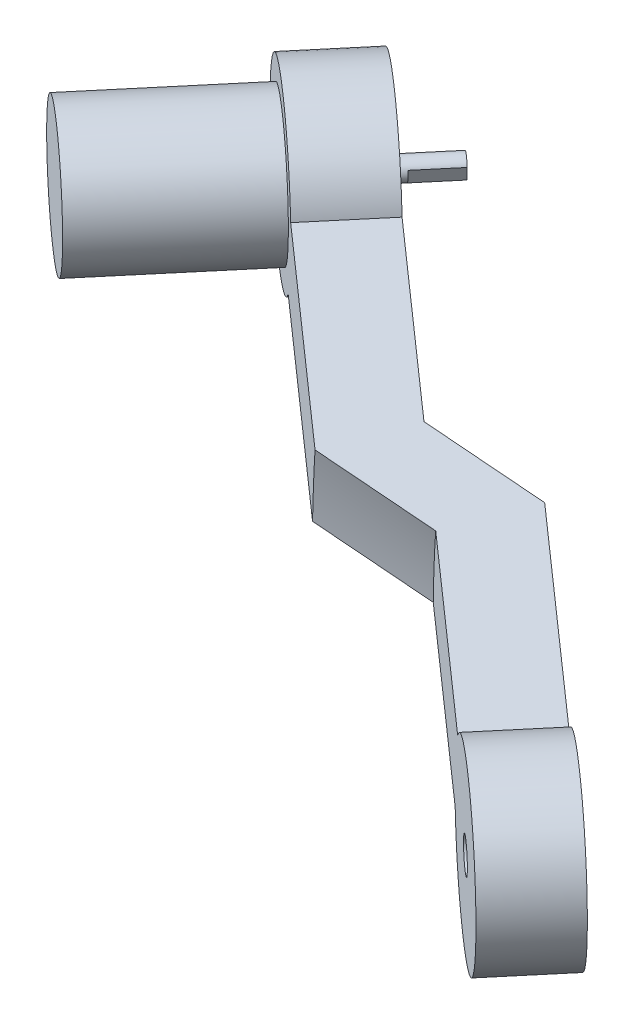
ISO-10303-21;
HEADER;
FILE_DESCRIPTION(('STEP AP214'),'2;1');
FILE_NAME('part.step','',(''),(''),'','','');
FILE_SCHEMA(('AUTOMOTIVE_DESIGN { 1 0 10303 214 1 1 1 1 }'));
ENDSEC;
DATA;
#1=APPLICATION_CONTEXT('core data for automotive mechanical design processes');
#2=APPLICATION_PROTOCOL_DEFINITION('international standard','automotive_design',2000,#1);
#3=PRODUCT_CONTEXT('',#1,'mechanical');
#4=PRODUCT('Part','Part','',(#3));
#5=PRODUCT_RELATED_PRODUCT_CATEGORY('part','',(#4));
#6=PRODUCT_DEFINITION_FORMATION('','',#4);
#7=PRODUCT_DEFINITION_CONTEXT('part definition',#1,'design');
#8=PRODUCT_DEFINITION('design','',#6,#7);
#9=PRODUCT_DEFINITION_SHAPE('','',#8);
#10=(LENGTH_UNIT() NAMED_UNIT(*) SI_UNIT(.MILLI.,.METRE.));
#11=(NAMED_UNIT(*) PLANE_ANGLE_UNIT() SI_UNIT($,.RADIAN.));
#12=(NAMED_UNIT(*) SI_UNIT($,.STERADIAN.) SOLID_ANGLE_UNIT());
#13=UNCERTAINTY_MEASURE_WITH_UNIT(LENGTH_MEASURE(1.E-05),#10,'distance_accuracy_value','');
#14=(GEOMETRIC_REPRESENTATION_CONTEXT(3) GLOBAL_UNCERTAINTY_ASSIGNED_CONTEXT((#13)) GLOBAL_UNIT_ASSIGNED_CONTEXT((#10,
#11,#12)) REPRESENTATION_CONTEXT('',''));
#15=CARTESIAN_POINT('',(0.,0.,0.));
#16=DIRECTION('',(0.,0.,1.));
#17=DIRECTION('',(1.,0.,0.));
#18=AXIS2_PLACEMENT_3D('',#15,#16,#17);
#19=CARTESIAN_POINT('',(8.60422844084496E-13,100.900000000001,8.04884587798926E-13));
#20=DIRECTION('',(0.644234817231313,0.,-0.764827758561977));
#21=DIRECTION('',(-0.198392279206198,-0.965771391852848,-0.167111107440478));
#22=AXIS2_PLACEMENT_3D('',#19,#20,#21);
#23=PLANE('',#22);
#24=CARTESIAN_POINT('',(8.60422844084496E-13,100.900000000001,8.04884587798926E-13));
#25=DIRECTION('',(0.644234817231313,0.,-0.764827758561977));
#26=DIRECTION('',(-0.198392279206198,-0.965771391852848,-0.167111107440478));
#27=AXIS2_PLACEMENT_3D('',#24,#25,#26);
#28=CIRCLE('',#27,3.);
#29=CARTESIAN_POINT('',(-0.595176837617734,98.0026858244429,-0.501333322320631));
#30=VERTEX_POINT('',#29);
#31=EDGE_CURVE('P0_E136',#30,#30,#28,.T.);
#32=ORIENTED_EDGE('',*,*,#31,.T.);
#33=EDGE_LOOP('',(#32));
#34=FACE_BOUND('',#33,.T.);
#35=DIRECTION('',(0.738648768914095,-0.259394715980515,0.62218355611755));
#36=VECTOR('',#35,1.);
#37=CARTESIAN_POINT('',(1.48794209404739,108.143285438898,1.25333330580443));
#38=LINE('',#37,#36);
#39=CARTESIAN_POINT('',(-35.7735755778973,121.22858551694,-30.1330367081199));
#40=VERTEX_POINT('',#39);
#41=CARTESIAN_POINT('',(-9.36793340379948,111.955593615657,-7.89086012722527));
#42=VERTEX_POINT('',#41);
#43=EDGE_CURVE('P0_E46',#40,#42,#38,.T.);
#44=ORIENTED_EDGE('',*,*,#43,.F.);
#45=CARTESIAN_POINT('',(8.60422844084496E-13,100.900000000001,8.04884587798926E-13));
#46=DIRECTION('',(0.644234817231313,0.,-0.764827758561977));
#47=DIRECTION('',(-0.198392279206198,-0.965771391852848,-0.167111107440478));
#48=AXIS2_PLACEMENT_3D('',#45,#46,#47);
#49=CIRCLE('',#48,51.0000000000001);
#50=CARTESIAN_POINT('',(-38.7494597659903,106.742014639147,-32.6397033197271));
#51=VERTEX_POINT('',#50);
#52=EDGE_CURVE('P0_E27',#40,#51,#49,.F.);
#53=ORIENTED_EDGE('',*,*,#52,.T.);
#54=DIRECTION('',(0.738648768914094,-0.259394715980517,0.622183556117549));
#55=VECTOR('',#54,1.);
#56=CARTESIAN_POINT('',(-1.48794209404563,93.656714561105,-1.25333330580279));
#57=LINE('',#56,#55);
#58=CARTESIAN_POINT('',(-12.3438175918926,97.4690227378636,-10.3975267388326));
#59=VERTEX_POINT('',#58);
#60=EDGE_CURVE('P0_E35',#51,#59,#57,.T.);
#61=ORIENTED_EDGE('',*,*,#60,.T.);
#62=CARTESIAN_POINT('',(8.60422844084496E-13,100.900000000001,8.04884587798926E-13));
#63=DIRECTION('',(0.644234817231313,0.,-0.764827758561977));
#64=DIRECTION('',(-0.198392279206198,-0.965771391852848,-0.167111107440478));
#65=AXIS2_PLACEMENT_3D('',#62,#63,#64);
#66=CIRCLE('',#65,16.5);
#67=EDGE_CURVE('P0_E139',#42,#59,#66,.T.);
#68=ORIENTED_EDGE('',*,*,#67,.F.);
#69=EDGE_LOOP('',(#44,#53,#61,#68));
#70=FACE_BOUND('',#69,.T.);
#71=ADVANCED_FACE('P0_F16',(#34,#70),#23,.F.);
#72=CARTESIAN_POINT('',(2.25482186031045,100.900000000001,-2.67689715496611));
#73=DIRECTION('',(-0.644234817231313,0.,0.764827758561977));
#74=DIRECTION('',(0.198392279206198,0.965771391852848,0.167111107440478));
#75=AXIS2_PLACEMENT_3D('',#72,#73,#74);
#76=CYLINDRICAL_SURFACE('',#75,16.5);
#77=ORIENTED_EDGE('',*,*,#67,.T.);
#78=DIRECTION('',(-0.644234817231313,0.,0.764827758561977));
#79=VECTOR('',#78,1.);
#80=CARTESIAN_POINT('',(-10.088995731583,97.4690227378637,-13.0744238937995));
#81=LINE('',#80,#79);
#82=CARTESIAN_POINT('',(-2.68029533342291,97.4690227378637,-21.8699431172622));
#83=VERTEX_POINT('',#82);
#84=EDGE_CURVE('P0_E147',#83,#59,#81,.T.);
#85=ORIENTED_EDGE('',*,*,#84,.F.);
#86=CARTESIAN_POINT('',(9.66352225847055,100.900000000001,-11.4724163784288));
#87=DIRECTION('',(0.644234817231313,0.,-0.764827758561977));
#88=DIRECTION('',(-0.198392279206198,-0.965771391852848,-0.167111107440478));
#89=AXIS2_PLACEMENT_3D('',#86,#87,#88);
#90=CIRCLE('',#89,16.5);
#91=CARTESIAN_POINT('',(0.295588854670211,111.955593615657,-19.3632765056549));
#92=VERTEX_POINT('',#91);
#93=EDGE_CURVE('P0_E129',#92,#83,#90,.T.);
#94=ORIENTED_EDGE('',*,*,#93,.F.);
#95=DIRECTION('',(-0.644234817231313,0.,0.764827758561977));
#96=VECTOR('',#95,1.);
#97=CARTESIAN_POINT('',(-7.11311154348989,111.955593615657,-10.5677572821922));
#98=LINE('',#97,#96);
#99=EDGE_CURVE('P0_E144',#92,#42,#98,.T.);
#100=ORIENTED_EDGE('',*,*,#99,.T.);
#101=EDGE_LOOP('',(#77,#85,#94,#100));
#102=FACE_BOUND('',#101,.T.);
#103=ADVANCED_FACE('P0_F174',(#102),#76,.T.);
#104=CARTESIAN_POINT('',(0.766879766263965,93.656714561105,-3.9302304607697));
#105=DIRECTION('',(-0.198392279206198,-0.965771391852848,-0.167111107440479));
#106=DIRECTION('',(-0.738648768914094,0.259394715980517,-0.622183556117549));
#107=AXIS2_PLACEMENT_3D('',#104,#105,#106);
#108=PLANE('',#107);
#109=ORIENTED_EDGE('',*,*,#60,.F.);
#110=CARTESIAN_POINT('',(-38.7494597659903,106.742014639147,-32.6397033197271));
#111=CARTESIAN_POINT('',(-40.4860172779279,107.069406063505,-32.4701494724891));
#112=CARTESIAN_POINT('',(-42.2225318554562,107.396670431259,-32.2999123087422));
#113=CARTESIAN_POINT('',(-45.6954879621573,108.050985891134,-31.9582921371573));
#114=CARTESIAN_POINT('',(-47.4319294913518,108.378036983318,-31.7869091296625));
#115=CARTESIAN_POINT('',(-50.9047531798364,109.031966891383,-31.4432179757123));
#116=CARTESIAN_POINT('',(-52.6411353391327,109.358845707281,-31.2709098293538));
#117=CARTESIAN_POINT('',(-56.1138502016387,110.012458871273,-30.9255173394852));
#118=CARTESIAN_POINT('',(-57.8501829048335,110.339193219324,-30.7524329957437));
#119=CARTESIAN_POINT('',(-59.5864952280891,110.665869123086,-30.5790350845735));
#120=B_SPLINE_CURVE_WITH_KNOTS('',3,(#110,#111,#112,#113,#114,#115,#116,#117,#118,#119),
.UNSPECIFIED.,.F.,.F.,(4,2,2,2,4),(0.,5.32579447535091,10.6515873559819,15.9773796785121,
21.3031735892705),.UNSPECIFIED.);
#121=CARTESIAN_POINT('',(-59.5864952280891,110.665869123086,-30.5790350845735));
#122=VERTEX_POINT('',#121);
#123=EDGE_CURVE('P0_E183',#51,#122,#120,.T.);
#124=ORIENTED_EDGE('',*,*,#123,.T.);
#125=DIRECTION('',(0.738648768914094,-0.259394715980517,0.622183556117549));
#126=VECTOR('',#125,1.);
#127=CARTESIAN_POINT('',(-11.1514643525153,93.656714561105,10.2190830726269));
#128=LINE('',#127,#126);
#129=CARTESIAN_POINT('',(-88.9334411243596,120.971772302009,-55.2987502284493));
#130=VERTEX_POINT('',#129);
#131=EDGE_CURVE('P0_E100',#130,#122,#128,.T.);
#132=ORIENTED_EDGE('',*,*,#131,.F.);
#133=DIRECTION('',(0.644234817231313,0.,-0.764827758561977));
#134=VECTOR('',#133,1.);
#135=CARTESIAN_POINT('',(-88.9334411243596,120.971772302009,-55.2987502284493));
#136=LINE('',#135,#134);
#137=CARTESIAN_POINT('',(-79.26991886589,120.971772302009,-66.7711666068789));
#138=VERTEX_POINT('',#137);
#139=EDGE_CURVE('P0_E99',#130,#138,#136,.T.);
#140=ORIENTED_EDGE('',*,*,#139,.T.);
#141=DIRECTION('',(0.738648768914094,-0.259394715980517,0.622183556117549));
#142=VECTOR('',#141,1.);
#143=CARTESIAN_POINT('',(-1.48794209404563,93.656714561105,-1.25333330580279));
#144=LINE('',#143,#142);
#145=CARTESIAN_POINT('',(-52.8642766917922,111.698780400725,-44.5289900259843));
#146=VERTEX_POINT('',#145);
#147=EDGE_CURVE('P0_E113',#138,#146,#144,.T.);
#148=ORIENTED_EDGE('',*,*,#147,.T.);
#149=CARTESIAN_POINT('',(-52.8642766917922,111.698780400725,-44.5289900259843));
#150=CARTESIAN_POINT('',(-51.1277191798546,111.371388976367,-44.6985438732223));
#151=CARTESIAN_POINT('',(-49.3912046023263,111.044124608613,-44.8687810369693));
#152=CARTESIAN_POINT('',(-45.9182484956252,110.389809148739,-45.2104012085541));
#153=CARTESIAN_POINT('',(-44.1818069664307,110.062758056554,-45.381784216049));
#154=CARTESIAN_POINT('',(-40.7089832779461,109.408828148489,-45.7254753699992));
#155=CARTESIAN_POINT('',(-38.9726011186499,109.081949332592,-45.8977835163577));
#156=CARTESIAN_POINT('',(-35.4998862561439,108.428336168599,-46.2431760062263));
#157=CARTESIAN_POINT('',(-33.7635535529492,108.101601820548,-46.4162603499679));
#158=CARTESIAN_POINT('',(-32.0272412296936,107.774925916786,-46.5896582611381));
#159=B_SPLINE_CURVE_WITH_KNOTS('',3,(#149,#150,#151,#152,#153,#154,#155,#156,#157,#158),
.UNSPECIFIED.,.F.,.F.,(4,2,2,2,4),(0.,5.32579447535085,10.6515873559818,15.9773796785119,
21.3031735892703),.UNSPECIFIED.);
#160=CARTESIAN_POINT('',(-32.0272412296936,107.774925916786,-46.5896582611381));
#161=VERTEX_POINT('',#160);
#162=EDGE_CURVE('P0_E177',#146,#161,#159,.T.);
#163=ORIENTED_EDGE('',*,*,#162,.T.);
#164=DIRECTION('',(0.738648768914094,-0.259394715980517,0.622183556117549));
#165=VECTOR('',#164,1.);
#166=CARTESIAN_POINT('',(8.17558016442406,93.6567145611051,-12.7257496842324));
#167=LINE('',#166,#165);
#168=EDGE_CURVE('P0_E132',#161,#83,#167,.T.);
#169=ORIENTED_EDGE('',*,*,#168,.T.);
#170=ORIENTED_EDGE('',*,*,#84,.T.);
#171=EDGE_LOOP('',(#109,#124,#132,#140,#148,#163,#169,#170));
#172=FACE_BOUND('',#171,.T.);
#173=ADVANCED_FACE('P0_F169',(#172),#108,.T.);
#174=CARTESIAN_POINT('',(2.25482186031045,100.900000000001,-2.67689715496611));
#175=DIRECTION('',(-0.644234817231313,0.,0.764827758561977));
#176=DIRECTION('',(0.198392279206198,0.965771391852848,0.167111107440478));
#177=AXIS2_PLACEMENT_3D('',#174,#175,#176);
#178=CYLINDRICAL_SURFACE('',#177,3.);
#179=ORIENTED_EDGE('',*,*,#31,.F.);
#180=EDGE_LOOP('',(#179));
#181=FACE_BOUND('',#180,.T.);
#182=CARTESIAN_POINT('',(9.66352225847055,100.900000000001,-11.4724163784288));
#183=DIRECTION('',(0.644234817231313,0.,-0.764827758561977));
#184=DIRECTION('',(-0.198392279206198,-0.965771391852848,-0.167111107440478));
#185=AXIS2_PLACEMENT_3D('',#182,#183,#184);
#186=CIRCLE('',#185,3.);
#187=CARTESIAN_POINT('',(9.06834542085195,98.0026858244429,-11.9737497007503));
#188=VERTEX_POINT('',#187);
#189=EDGE_CURVE('P0_E125',#188,#188,#186,.T.);
#190=ORIENTED_EDGE('',*,*,#189,.T.);
#191=EDGE_LOOP('',(#190));
#192=FACE_BOUND('',#191,.T.);
#193=ADVANCED_FACE('P0_F167',(#181,#192),#178,.F.);
#194=CARTESIAN_POINT('',(3.74276395435699,108.143285438898,-1.42356384916249));
#195=DIRECTION('',(-0.198392279206196,-0.965771391852849,-0.167111107440477));
#196=DIRECTION('',(-0.738648768914095,0.259394715980515,-0.62218355611755));
#197=AXIS2_PLACEMENT_3D('',#194,#195,#196);
#198=PLANE('',#197);
#199=CARTESIAN_POINT('',(-56.6106110399961,125.152440000879,-28.0723684729663));
#200=CARTESIAN_POINT('',(-54.8742987167405,124.825764097117,-28.2457663841365));
#201=CARTESIAN_POINT('',(-53.1379660135457,124.499029749066,-28.418850727878));
#202=CARTESIAN_POINT('',(-49.6652511510397,123.845416585073,-28.7642432177466));
#203=CARTESIAN_POINT('',(-47.9288689917434,123.518537769176,-28.9365513641051));
#204=CARTESIAN_POINT('',(-44.4560453032588,122.864607861111,-29.2802425180553));
#205=CARTESIAN_POINT('',(-42.7196037740643,122.537556768926,-29.4516255255501));
#206=CARTESIAN_POINT('',(-39.2466476673632,121.883241309052,-29.7932456971349));
#207=CARTESIAN_POINT('',(-37.5101330898349,121.555976941298,-29.9634828608819));
#208=CARTESIAN_POINT('',(-35.7735755778973,121.22858551694,-30.1330367081199));
#209=B_SPLINE_CURVE_WITH_KNOTS('',3,(#199,#200,#201,#202,#203,#204,#205,#206,#207,#208),
.UNSPECIFIED.,.F.,.F.,(4,2,2,2,4),(0.,5.32579391075844,10.6515862332886,15.9773791139196,
21.3031735892705),.UNSPECIFIED.);
#210=CARTESIAN_POINT('',(-56.6106110399961,125.152440000879,-28.0723684729663));
#211=VERTEX_POINT('',#210);
#212=EDGE_CURVE('P0_E156',#211,#40,#209,.T.);
#213=ORIENTED_EDGE('',*,*,#212,.T.);
#214=ORIENTED_EDGE('',*,*,#43,.T.);
#215=ORIENTED_EDGE('',*,*,#99,.F.);
#216=DIRECTION('',(0.738648768914095,-0.259394715980515,0.62218355611755));
#217=VECTOR('',#216,1.);
#218=CARTESIAN_POINT('',(11.1514643525171,108.143285438898,-10.2190830726252));
#219=LINE('',#218,#217);
#220=CARTESIAN_POINT('',(-29.0513570416006,122.261496794579,-44.0829916495309));
#221=VERTEX_POINT('',#220);
#222=EDGE_CURVE('P0_E134',#221,#92,#219,.T.);
#223=ORIENTED_EDGE('',*,*,#222,.F.);
#224=CARTESIAN_POINT('',(-29.0513570416006,122.261496794579,-44.0829916495309));
#225=CARTESIAN_POINT('',(-30.7876693648562,122.588172698341,-43.9095937383607));
#226=CARTESIAN_POINT('',(-32.524002068051,122.914907046392,-43.7365093946191));
#227=CARTESIAN_POINT('',(-35.9967169305569,123.568520210385,-43.3911169047505));
#228=CARTESIAN_POINT('',(-37.7330990898532,123.895399026282,-43.218808758392));
#229=CARTESIAN_POINT('',(-41.2059227783377,124.549328934347,-42.8751176044418));
#230=CARTESIAN_POINT('',(-42.9423643075322,124.876380026531,-42.703734596947));
#231=CARTESIAN_POINT('',(-46.4153204142333,125.530695486406,-42.3621144253621));
#232=CARTESIAN_POINT('',(-48.1518349917616,125.85795985416,-42.1918772616151));
#233=CARTESIAN_POINT('',(-49.8883925036992,126.185351278518,-42.0223234143771));
#234=B_SPLINE_CURVE_WITH_KNOTS('',3,(#224,#225,#226,#227,#228,#229,#230,#231,#232,#233),
.UNSPECIFIED.,.F.,.F.,(4,2,2,2,4),(0.,5.32579391075838,10.6515862332885,15.9773791139194,
21.3031735892703),.UNSPECIFIED.);
#235=CARTESIAN_POINT('',(-49.8883925036992,126.185351278518,-42.0223234143771));
#236=VERTEX_POINT('',#235);
#237=EDGE_CURVE('P0_E62',#221,#236,#234,.T.);
#238=ORIENTED_EDGE('',*,*,#237,.T.);
#239=DIRECTION('',(0.738648768914095,-0.259394715980515,0.62218355611755));
#240=VECTOR('',#239,1.);
#241=CARTESIAN_POINT('',(1.48794209404739,108.143285438898,1.25333330580443));
#242=LINE('',#241,#240);
#243=CARTESIAN_POINT('',(-76.294034677797,135.458343179801,-64.2644999952717));
#244=VERTEX_POINT('',#243);
#245=EDGE_CURVE('P0_E54',#244,#236,#242,.T.);
#246=ORIENTED_EDGE('',*,*,#245,.F.);
#247=DIRECTION('',(0.644234817231313,0.,-0.764827758561977));
#248=VECTOR('',#247,1.);
#249=CARTESIAN_POINT('',(-85.9575569362667,135.458343179801,-52.7920836168421));
#250=LINE('',#249,#248);
#251=CARTESIAN_POINT('',(-85.9575569362667,135.458343179801,-52.7920836168421));
#252=VERTEX_POINT('',#251);
#253=EDGE_CURVE('P0_E92',#252,#244,#250,.T.);
#254=ORIENTED_EDGE('',*,*,#253,.F.);
#255=DIRECTION('',(0.738648768914095,-0.259394715980515,0.62218355611755));
#256=VECTOR('',#255,1.);
#257=CARTESIAN_POINT('',(-8.1755801644223,108.143285438898,12.7257496842341));
#258=LINE('',#257,#256);
#259=EDGE_CURVE('P0_E95',#252,#211,#258,.T.);
#260=ORIENTED_EDGE('',*,*,#259,.T.);
#261=EDGE_LOOP('',(#213,#214,#215,#223,#238,#246,#254,#260));
#262=FACE_BOUND('',#261,.T.);
#263=ADVANCED_FACE('P0_F94',(#262),#198,.F.);
#264=CARTESIAN_POINT('',(9.66352225847055,100.900000000001,-11.4724163784288));
#265=DIRECTION('',(0.644234817231313,0.,-0.764827758561977));
#266=DIRECTION('',(-0.198392279206198,-0.965771391852848,-0.167111107440478));
#267=AXIS2_PLACEMENT_3D('',#264,#265,#266);
#268=PLANE('',#267);
#269=ORIENTED_EDGE('',*,*,#189,.F.);
#270=EDGE_LOOP('',(#269));
#271=FACE_BOUND('',#270,.T.);
#272=ORIENTED_EDGE('',*,*,#168,.F.);
#273=CARTESIAN_POINT('',(-78.9743300112208,132.027365917664,-86.1344431125348));
#274=DIRECTION('',(0.644234817231313,0.,-0.764827758561977));
#275=DIRECTION('',(-0.198392279206198,-0.965771391852848,-0.167111107440478));
#276=AXIS2_PLACEMENT_3D('',#273,#274,#275);
#277=CIRCLE('',#276,66.0000000000001);
#278=EDGE_CURVE('P0_E189',#161,#221,#277,.F.);
#279=ORIENTED_EDGE('',*,*,#278,.T.);
#280=ORIENTED_EDGE('',*,*,#222,.T.);
#281=ORIENTED_EDGE('',*,*,#93,.T.);
#282=EDGE_LOOP('',(#272,#279,#280,#281));
#283=FACE_BOUND('',#282,.T.);
#284=ADVANCED_FACE('P0_F166',(#271,#283),#268,.T.);
#285=CARTESIAN_POINT('',(-98.3013745281601,132.027365917663,-63.1896103556755));
#286=DIRECTION('',(0.644234817231313,0.,-0.764827758561977));
#287=DIRECTION('',(-0.198392279206198,-0.965771391852848,-0.167111107440478));
#288=AXIS2_PLACEMENT_3D('',#285,#286,#287);
#289=CYLINDRICAL_SURFACE('',#288,16.5);
#290=CARTESIAN_POINT('',(-88.6378522696905,132.027365917663,-74.6620267341051));
#291=DIRECTION('',(0.644234817231313,0.,-0.764827758561977));
#292=DIRECTION('',(-0.198392279206198,-0.965771391852848,-0.167111107440478));
#293=AXIS2_PLACEMENT_3D('',#290,#291,#292);
#294=CIRCLE('',#293,16.5);
#295=EDGE_CURVE('P0_E121',#138,#244,#294,.T.);
#296=ORIENTED_EDGE('',*,*,#295,.F.);
#297=ORIENTED_EDGE('',*,*,#139,.F.);
#298=CARTESIAN_POINT('',(-98.3013745281601,132.027365917663,-63.1896103556755));
#299=DIRECTION('',(0.644234817231313,0.,-0.764827758561977));
#300=DIRECTION('',(-0.198392279206198,-0.965771391852848,-0.167111107440478));
#301=AXIS2_PLACEMENT_3D('',#298,#299,#300);
#302=CIRCLE('',#301,16.5);
#303=EDGE_CURVE('P0_E107',#130,#252,#302,.T.);
#304=ORIENTED_EDGE('',*,*,#303,.T.);
#305=ORIENTED_EDGE('',*,*,#253,.T.);
#306=EDGE_LOOP('',(#296,#297,#304,#305));
#307=FACE_BOUND('',#306,.T.);
#308=ADVANCED_FACE('P0_F111',(#307),#289,.T.);
#309=CARTESIAN_POINT('',(-9.66352225846883,100.900000000001,11.4724163784305));
#310=DIRECTION('',(0.644234817231313,0.,-0.764827758561977));
#311=DIRECTION('',(-0.198392279206198,-0.965771391852848,-0.167111107440478));
#312=AXIS2_PLACEMENT_3D('',#309,#310,#311);
#313=PLANE('',#312);
#314=CARTESIAN_POINT('',(-98.3013745281601,132.027365917663,-63.1896103556755));
#315=DIRECTION('',(-0.644234817231313,0.,0.764827758561977));
#316=DIRECTION('',(0.198392279206198,0.965771391852848,0.167111107440478));
#317=AXIS2_PLACEMENT_3D('',#314,#315,#316);
#318=CIRCLE('',#317,12.5);
#319=CARTESIAN_POINT('',(-95.8214710380826,144.099508315824,-61.1007215126695));
#320=VERTEX_POINT('',#319);
#321=EDGE_CURVE('P0_E117',#320,#320,#318,.T.);
#322=ORIENTED_EDGE('',*,*,#321,.F.);
#323=EDGE_LOOP('',(#322));
#324=FACE_BOUND('',#323,.T.);
#325=ORIENTED_EDGE('',*,*,#131,.T.);
#326=CARTESIAN_POINT('',(-9.66352225846883,100.900000000001,11.4724163784305));
#327=DIRECTION('',(0.644234817231313,0.,-0.764827758561977));
#328=DIRECTION('',(-0.198392279206198,-0.965771391852848,-0.167111107440478));
#329=AXIS2_PLACEMENT_3D('',#326,#327,#328);
#330=CIRCLE('',#329,66.0000000000003);
#331=EDGE_CURVE('P0_E109',#122,#211,#330,.T.);
#332=ORIENTED_EDGE('',*,*,#331,.T.);
#333=ORIENTED_EDGE('',*,*,#259,.F.);
#334=ORIENTED_EDGE('',*,*,#303,.F.);
#335=EDGE_LOOP('',(#325,#332,#333,#334));
#336=FACE_BOUND('',#335,.T.);
#337=ADVANCED_FACE('P0_F106',(#324,#336),#313,.F.);
#338=CARTESIAN_POINT('',(8.60422844084496E-13,100.900000000001,8.04884587798926E-13));
#339=DIRECTION('',(0.644234817231313,0.,-0.764827758561977));
#340=DIRECTION('',(-0.198392279206198,-0.965771391852848,-0.167111107440478));
#341=AXIS2_PLACEMENT_3D('',#338,#339,#340);
#342=PLANE('',#341);
#343=ORIENTED_EDGE('',*,*,#245,.T.);
#344=CARTESIAN_POINT('',(-88.6378522696905,132.027365917663,-74.6620267341051));
#345=DIRECTION('',(0.644234817231313,0.,-0.764827758561977));
#346=DIRECTION('',(-0.198392279206198,-0.965771391852848,-0.167111107440478));
#347=AXIS2_PLACEMENT_3D('',#344,#345,#346);
#348=CIRCLE('',#347,51.0000000000003);
#349=EDGE_CURVE('P0_E10',#236,#146,#348,.T.);
#350=ORIENTED_EDGE('',*,*,#349,.T.);
#351=ORIENTED_EDGE('',*,*,#147,.F.);
#352=ORIENTED_EDGE('',*,*,#295,.T.);
#353=EDGE_LOOP('',(#343,#350,#351,#352));
#354=FACE_BOUND('',#353,.T.);
#355=ADVANCED_FACE('P0_F197',(#354),#342,.T.);
#356=CARTESIAN_POINT('',(-9.66352225846883,100.900000000001,11.4724163784305));
#357=DIRECTION('',(-0.644234817231313,0.,0.764827758561977));
#358=DIRECTION('',(0.198392279206198,0.965771391852848,0.167111107440478));
#359=AXIS2_PLACEMENT_3D('',#356,#357,#358);
#360=CONICAL_SURFACE('',#359,66.0000000000003,0.785398163397453);
#361=ORIENTED_EDGE('',*,*,#123,.F.);
#362=ORIENTED_EDGE('',*,*,#52,.F.);
#363=ORIENTED_EDGE('',*,*,#212,.F.);
#364=ORIENTED_EDGE('',*,*,#331,.F.);
#365=EDGE_LOOP('',(#361,#362,#363,#364));
#366=FACE_BOUND('',#365,.T.);
#367=ADVANCED_FACE('P0_F191',(#366),#360,.F.);
#368=CARTESIAN_POINT('',(-89.2820870869219,132.027365917663,-73.8971989755429));
#369=DIRECTION('',(0.644234817231313,0.,-0.764827758561977));
#370=DIRECTION('',(-0.198392279206198,-0.965771391852848,-0.167111107440478));
#371=AXIS2_PLACEMENT_3D('',#368,#369,#370);
#372=CONICAL_SURFACE('',#371,50.,0.785398163397443);
#373=ORIENTED_EDGE('',*,*,#237,.F.);
#374=ORIENTED_EDGE('',*,*,#278,.F.);
#375=ORIENTED_EDGE('',*,*,#162,.F.);
#376=ORIENTED_EDGE('',*,*,#349,.F.);
#377=EDGE_LOOP('',(#373,#374,#375,#376));
#378=FACE_BOUND('',#377,.T.);
#379=ADVANCED_FACE('P0_F19',(#378),#372,.F.);
#380=CARTESIAN_POINT('',(-90.1840158310456,132.027365917663,-72.8264401135564));
#381=DIRECTION('',(-0.644234817231313,0.,0.764827758561977));
#382=DIRECTION('',(0.198392279206198,0.965771391852848,0.167111107440478));
#383=AXIS2_PLACEMENT_3D('',#380,#381,#382);
#384=CYLINDRICAL_SURFACE('',#383,3.5);
#385=CARTESIAN_POINT('',(-90.1840158310456,132.027365917663,-72.8264401135564));
#386=DIRECTION('',(-0.644234817231313,0.,0.764827758561977));
#387=DIRECTION('',(0.198392279206198,0.965771391852848,0.167111107440478));
#388=AXIS2_PLACEMENT_3D('',#385,#386,#387);
#389=CIRCLE('',#388,3.5);
#390=CARTESIAN_POINT('',(-89.4896428538239,135.407565789148,-72.2415512375147));
#391=VERTEX_POINT('',#390);
#392=EDGE_CURVE('P0_E372',#391,#391,#389,.T.);
#393=ORIENTED_EDGE('',*,*,#392,.T.);
#394=EDGE_LOOP('',(#393));
#395=FACE_BOUND('',#394,.T.);
#396=CARTESIAN_POINT('',(-98.3013745281601,132.027365917663,-63.1896103556755));
#397=DIRECTION('',(-0.644234817231313,0.,0.764827758561977));
#398=DIRECTION('',(0.198392279206198,0.965771391852848,0.167111107440478));
#399=AXIS2_PLACEMENT_3D('',#396,#397,#398);
#400=CIRCLE('',#399,3.5);
#401=CARTESIAN_POINT('',(-97.6070015509384,135.407565789148,-62.6047214796338));
#402=VERTEX_POINT('',#401);
#403=EDGE_CURVE('P0_E359',#402,#402,#400,.T.);
#404=ORIENTED_EDGE('',*,*,#403,.F.);
#405=EDGE_LOOP('',(#404));
#406=FACE_BOUND('',#405,.T.);
#407=ADVANCED_FACE('P0_F280',(#395,#406),#384,.T.);
#408=CARTESIAN_POINT('',(-91.8703502042983,123.818309086914,-74.2468845268005));
#409=DIRECTION('',(-0.644234817231313,0.,0.764827758561977));
#410=DIRECTION('',(0.198392279206198,0.965771391852848,0.167111107440478));
#411=AXIS2_PLACEMENT_3D('',#408,#409,#410);
#412=CYLINDRICAL_SURFACE('',#411,1.5);
#413=CARTESIAN_POINT('',(-91.8703502042983,123.818309086914,-74.2468845268005));
#414=DIRECTION('',(-0.644234817231313,0.,0.764827758561977));
#415=DIRECTION('',(0.198392279206198,0.965771391852848,0.167111107440478));
#416=AXIS2_PLACEMENT_3D('',#413,#414,#415);
#417=CIRCLE('',#416,1.5);
#418=CARTESIAN_POINT('',(-91.572761785489,125.266966174694,-73.9962178656398));
#419=VERTEX_POINT('',#418);
#420=EDGE_CURVE('P0_E375',#419,#419,#417,.T.);
#421=ORIENTED_EDGE('',*,*,#420,.T.);
#422=EDGE_LOOP('',(#421));
#423=FACE_BOUND('',#422,.T.);
#424=CARTESIAN_POINT('',(-99.9877089014129,123.818309086914,-64.6100547689196));
#425=DIRECTION('',(-0.644234817231313,0.,0.764827758561977));
#426=DIRECTION('',(0.198392279206198,0.965771391852848,0.167111107440478));
#427=AXIS2_PLACEMENT_3D('',#424,#425,#426);
#428=CIRCLE('',#427,1.5);
#429=CARTESIAN_POINT('',(-99.6901204826036,125.266966174694,-64.3593881077588));
#430=VERTEX_POINT('',#429);
#431=EDGE_CURVE('P0_E361',#430,#430,#428,.T.);
#432=ORIENTED_EDGE('',*,*,#431,.F.);
#433=EDGE_LOOP('',(#432));
#434=FACE_BOUND('',#433,.T.);
#435=ADVANCED_FACE('P0_F288',(#423,#434),#412,.T.);
#436=CARTESIAN_POINT('',(-88.4976814577929,140.236422748413,-71.4059957003123));
#437=DIRECTION('',(-0.644234817231313,0.,0.764827758561977));
#438=DIRECTION('',(0.198392279206198,0.965771391852848,0.167111107440478));
#439=AXIS2_PLACEMENT_3D('',#436,#437,#438);
#440=CYLINDRICAL_SURFACE('',#439,1.5);
#441=CARTESIAN_POINT('',(-88.4976814577929,140.236422748413,-71.4059957003123));
#442=DIRECTION('',(-0.644234817231313,0.,0.764827758561977));
#443=DIRECTION('',(0.198392279206198,0.965771391852848,0.167111107440478));
#444=AXIS2_PLACEMENT_3D('',#441,#442,#443);
#445=CIRCLE('',#444,1.5);
#446=CARTESIAN_POINT('',(-88.2000930389836,141.685079836192,-71.1553290391516));
#447=VERTEX_POINT('',#446);
#448=EDGE_CURVE('P0_E363',#447,#447,#445,.T.);
#449=ORIENTED_EDGE('',*,*,#448,.T.);
#450=EDGE_LOOP('',(#449));
#451=FACE_BOUND('',#450,.T.);
#452=CARTESIAN_POINT('',(-96.6150401549074,140.236422748413,-61.7691659424314));
#453=DIRECTION('',(-0.644234817231313,0.,0.764827758561977));
#454=DIRECTION('',(0.198392279206198,0.965771391852848,0.167111107440478));
#455=AXIS2_PLACEMENT_3D('',#452,#453,#454);
#456=CIRCLE('',#455,1.5);
#457=CARTESIAN_POINT('',(-96.3174517360981,141.685079836192,-61.5184992812707));
#458=VERTEX_POINT('',#457);
#459=EDGE_CURVE('P0_E365',#458,#458,#456,.T.);
#460=ORIENTED_EDGE('',*,*,#459,.F.);
#461=EDGE_LOOP('',(#460));
#462=FACE_BOUND('',#461,.T.);
#463=ADVANCED_FACE('P0_F298',(#451,#462),#440,.T.);
#464=CARTESIAN_POINT('',(-90.1840158310456,132.027365917663,-72.8264401135564));
#465=DIRECTION('',(-0.644234817231313,0.,0.764827758561977));
#466=DIRECTION('',(0.198392279206198,0.965771391852848,0.167111107440478));
#467=AXIS2_PLACEMENT_3D('',#464,#465,#466);
#468=CYLINDRICAL_SURFACE('',#467,12.5);
#469=CARTESIAN_POINT('',(-90.1840158310456,132.027365917663,-72.8264401135564));
#470=DIRECTION('',(-0.644234817231313,0.,0.764827758561977));
#471=DIRECTION('',(0.198392279206198,0.965771391852848,0.167111107440478));
#472=AXIS2_PLACEMENT_3D('',#469,#470,#471);
#473=CIRCLE('',#472,12.5);
#474=CARTESIAN_POINT('',(-87.7041123409681,144.099508315824,-70.7375512705504));
#475=VERTEX_POINT('',#474);
#476=EDGE_CURVE('P0_E123',#475,#475,#473,.T.);
#477=ORIENTED_EDGE('',*,*,#476,.F.);
#478=EDGE_LOOP('',(#477));
#479=FACE_BOUND('',#478,.T.);
#480=ORIENTED_EDGE('',*,*,#321,.T.);
#481=EDGE_LOOP('',(#480));
#482=FACE_BOUND('',#481,.T.);
#483=ADVANCED_FACE('P0_F308',(#479,#482),#468,.F.);
#484=CARTESIAN_POINT('',(-1.54616356135429,100.900000000001,1.83558662054955));
#485=DIRECTION('',(-0.644234817231313,0.,0.764827758561977));
#486=DIRECTION('',(0.198392279206198,0.965771391852848,0.167111107440478));
#487=AXIS2_PLACEMENT_3D('',#484,#485,#486);
#488=PLANE('',#487);
#489=ORIENTED_EDGE('',*,*,#448,.F.);
#490=EDGE_LOOP('',(#489));
#491=FACE_BOUND('',#490,.T.);
#492=ORIENTED_EDGE('',*,*,#420,.F.);
#493=EDGE_LOOP('',(#492));
#494=FACE_BOUND('',#493,.T.);
#495=ORIENTED_EDGE('',*,*,#392,.F.);
#496=EDGE_LOOP('',(#495));
#497=FACE_BOUND('',#496,.T.);
#498=ORIENTED_EDGE('',*,*,#476,.T.);
#499=EDGE_LOOP('',(#498));
#500=FACE_BOUND('',#499,.T.);
#501=ADVANCED_FACE('P0_F317',(#491,#494,#497,#500),#488,.T.);
#502=ORIENTED_EDGE('',*,*,#459,.T.);
#503=EDGE_LOOP('',(#502));
#504=FACE_BOUND('',#503,.T.);
#505=ADVANCED_FACE('P0_F233',(#504),#313,.F.);
#506=ORIENTED_EDGE('',*,*,#431,.T.);
#507=EDGE_LOOP('',(#506));
#508=FACE_BOUND('',#507,.T.);
#509=ADVANCED_FACE('P0_F336',(#508),#313,.F.);
#510=ORIENTED_EDGE('',*,*,#403,.T.);
#511=EDGE_LOOP('',(#510));
#512=FACE_BOUND('',#511,.T.);
#513=ADVANCED_FACE('P0_F232',(#512),#313,.F.);
#514=CLOSED_SHELL('',(#71,#103,#173,#193,#263,#284,#308,#337,#355,#367,#379,#407,#435,#463,#483,
#501,#505,#509,#513));
#515=MANIFOLD_SOLID_BREP('P0_B1',#514);
#516=CARTESIAN_POINT('',(-83.6728016352065,132.546155349623,-83.5546714319608));
#517=DIRECTION('',(0.644234817231313,0.,-0.764827758561976));
#518=DIRECTION('',(-0.738648768914094,0.259394715980516,-0.62218355611755));
#519=AXIS2_PLACEMENT_3D('',#516,#517,#518);
#520=PLANE('',#519);
#521=DIRECTION('',(0.198392279206197,0.965771391852848,0.167111107440478));
#522=VECTOR('',#521,1.);
#523=CARTESIAN_POINT('',(-81.0875309440071,131.638273843692,-81.3770289855493));
#524=LINE('',#523,#522);
#525=CARTESIAN_POINT('',(-81.3499792604146,130.3606783806,-81.5980962013514));
#526=VERTEX_POINT('',#525);
#527=CARTESIAN_POINT('',(-80.8250826275997,132.915869306783,-81.1559617697473));
#528=VERTEX_POINT('',#527);
#529=EDGE_CURVE('P1_E45',#526,#528,#524,.T.);
#530=ORIENTED_EDGE('',*,*,#529,.F.);
#531=CARTESIAN_POINT('',(-82.1955040973783,132.027365917662,-82.3103043197257));
#532=DIRECTION('',(0.644234817231313,0.,-0.764827758561976));
#533=DIRECTION('',(-0.738648768914094,0.259394715980516,-0.62218355611755));
#534=AXIS2_PLACEMENT_3D('',#531,#532,#533);
#535=CIRCLE('',#534,2.);
#536=EDGE_CURVE('P1_E53',#526,#528,#535,.T.);
#537=ORIENTED_EDGE('',*,*,#536,.T.);
#538=EDGE_LOOP('',(#530,#537));
#539=FACE_BOUND('',#538,.T.);
#540=ADVANCED_FACE('P1_F17',(#539),#520,.T.);
#541=CARTESIAN_POINT('',(-127.119222583419,135.269799867419,-47.7161409468616));
#542=DIRECTION('',(-0.644234817231313,0.,0.764827758561976));
#543=DIRECTION('',(0.738648768914094,-0.259394715980516,0.62218355611755));
#544=AXIS2_PLACEMENT_3D('',#541,#542,#543);
#545=PLANE('',#544);
#546=CARTESIAN_POINT('',(-117.886112971993,132.027365917662,-39.9388464953922));
#547=DIRECTION('',(0.644234817231313,0.,-0.764827758561976));
#548=DIRECTION('',(-0.738648768914094,0.259394715980516,-0.62218355611755));
#549=AXIS2_PLACEMENT_3D('',#546,#547,#548);
#550=CIRCLE('',#549,12.5);
#551=CARTESIAN_POINT('',(-127.119222583419,135.269799867419,-47.7161409468616));
#552=VERTEX_POINT('',#551);
#553=EDGE_CURVE('P1_E11',#552,#552,#550,.T.);
#554=ORIENTED_EDGE('',*,*,#553,.F.);
#555=EDGE_LOOP('',(#554));
#556=FACE_BOUND('',#555,.T.);
#557=ADVANCED_FACE('P1_F82',(#556),#545,.T.);
#558=CARTESIAN_POINT('',(-82.1955040973783,132.027365917662,-82.3103043197257));
#559=DIRECTION('',(0.644234817231313,0.,-0.764827758561976));
#560=DIRECTION('',(-0.738648768914094,0.259394715980516,-0.62218355611755));
#561=AXIS2_PLACEMENT_3D('',#558,#559,#560);
#562=CYLINDRICAL_SURFACE('',#561,12.5);
#563=ORIENTED_EDGE('',*,*,#553,.T.);
#564=EDGE_LOOP('',(#563));
#565=FACE_BOUND('',#564,.T.);
#566=CARTESIAN_POINT('',(-90.1840158310465,132.027365917662,-72.8264401135572));
#567=DIRECTION('',(0.644234817231313,0.,-0.764827758561976));
#568=DIRECTION('',(-0.738648768914094,0.259394715980516,-0.62218355611755));
#569=AXIS2_PLACEMENT_3D('',#566,#567,#568);
#570=CIRCLE('',#569,12.5);
#571=CARTESIAN_POINT('',(-99.4171254424727,135.269799867419,-80.6037345650265));
#572=VERTEX_POINT('',#571);
#573=EDGE_CURVE('P1_E24',#572,#572,#570,.T.);
#574=ORIENTED_EDGE('',*,*,#573,.F.);
#575=EDGE_LOOP('',(#574));
#576=FACE_BOUND('',#575,.T.);
#577=ADVANCED_FACE('P1_F80',(#565,#576),#562,.T.);
#578=CARTESIAN_POINT('',(-99.4171254424727,135.269799867419,-80.6037345650265));
#579=DIRECTION('',(0.644234817231313,0.,-0.764827758561976));
#580=DIRECTION('',(-0.738648768914094,0.259394715980516,-0.62218355611755));
#581=AXIS2_PLACEMENT_3D('',#578,#579,#580);
#582=PLANE('',#581);
#583=CARTESIAN_POINT('',(-91.8703502042992,123.818309086913,-74.2468845268012));
#584=DIRECTION('',(0.644234817231313,0.,-0.764827758561976));
#585=DIRECTION('',(-0.738648768914094,0.259394715980516,-0.62218355611755));
#586=AXIS2_PLACEMENT_3D('',#583,#584,#585);
#587=CIRCLE('',#586,1.6);
#588=CARTESIAN_POINT('',(-93.0521882345618,124.233340632482,-75.2423782165893));
#589=VERTEX_POINT('',#588);
#590=EDGE_CURVE('P1_E64',#589,#589,#587,.T.);
#591=ORIENTED_EDGE('',*,*,#590,.F.);
#592=EDGE_LOOP('',(#591));
#593=FACE_BOUND('',#592,.T.);
#594=CARTESIAN_POINT('',(-88.4976814577939,140.236422748412,-71.4059957003131));
#595=DIRECTION('',(0.644234817231313,0.,-0.764827758561976));
#596=DIRECTION('',(-0.738648768914094,0.259394715980516,-0.62218355611755));
#597=AXIS2_PLACEMENT_3D('',#594,#595,#596);
#598=CIRCLE('',#597,1.6);
#599=CARTESIAN_POINT('',(-89.6795194880565,140.65145429398,-72.4014893901012));
#600=VERTEX_POINT('',#599);
#601=EDGE_CURVE('P1_E67',#600,#600,#598,.T.);
#602=ORIENTED_EDGE('',*,*,#601,.F.);
#603=EDGE_LOOP('',(#602));
#604=FACE_BOUND('',#603,.T.);
#605=ORIENTED_EDGE('',*,*,#573,.T.);
#606=EDGE_LOOP('',(#605));
#607=FACE_BOUND('',#606,.T.);
#608=CARTESIAN_POINT('',(-90.1840158310465,132.027365917662,-72.8264401135572));
#609=DIRECTION('',(0.644234817231313,0.,-0.764827758561976));
#610=DIRECTION('',(-0.738648768914094,0.259394715980516,-0.62218355611755));
#611=AXIS2_PLACEMENT_3D('',#608,#609,#610);
#612=CIRCLE('',#611,3.5);
#613=CARTESIAN_POINT('',(-92.7692865222459,132.935247423594,-75.0040825599686));
#614=VERTEX_POINT('',#613);
#615=EDGE_CURVE('P1_E72',#614,#614,#612,.T.);
#616=ORIENTED_EDGE('',*,*,#615,.F.);
#617=EDGE_LOOP('',(#616));
#618=FACE_BOUND('',#617,.T.);
#619=ADVANCED_FACE('P1_F77',(#593,#604,#607,#618),#582,.T.);
#620=CARTESIAN_POINT('',(-82.1955040973783,132.027365917662,-82.3103043197257));
#621=DIRECTION('',(0.644234817231313,0.,-0.764827758561976));
#622=DIRECTION('',(-0.738648768914094,0.259394715980516,-0.62218355611755));
#623=AXIS2_PLACEMENT_3D('',#620,#621,#622);
#624=CYLINDRICAL_SURFACE('',#623,3.5);
#625=ORIENTED_EDGE('',*,*,#615,.T.);
#626=EDGE_LOOP('',(#625));
#627=FACE_BOUND('',#626,.T.);
#628=CARTESIAN_POINT('',(-88.6378522696914,132.027365917662,-74.6620267341059));
#629=DIRECTION('',(0.644234817231313,0.,-0.764827758561976));
#630=DIRECTION('',(-0.738648768914094,0.259394715980516,-0.62218355611755));
#631=AXIS2_PLACEMENT_3D('',#628,#629,#630);
#632=CIRCLE('',#631,3.5);
#633=CARTESIAN_POINT('',(-91.2231229608907,132.935247423594,-76.8396691805173));
#634=VERTEX_POINT('',#633);
#635=EDGE_CURVE('P1_E61',#634,#634,#632,.T.);
#636=ORIENTED_EDGE('',*,*,#635,.F.);
#637=EDGE_LOOP('',(#636));
#638=FACE_BOUND('',#637,.T.);
#639=ADVANCED_FACE('P1_F90',(#627,#638),#624,.T.);
#640=CARTESIAN_POINT('',(-91.2231229608907,132.935247423594,-76.8396691805173));
#641=DIRECTION('',(0.644234817231313,0.,-0.764827758561976));
#642=DIRECTION('',(-0.738648768914094,0.259394715980516,-0.62218355611755));
#643=AXIS2_PLACEMENT_3D('',#640,#641,#642);
#644=PLANE('',#643);
#645=ORIENTED_EDGE('',*,*,#635,.T.);
#646=EDGE_LOOP('',(#645));
#647=FACE_BOUND('',#646,.T.);
#648=CARTESIAN_POINT('',(-88.6378522696914,132.027365917662,-74.6620267341059));
#649=DIRECTION('',(0.644234817231313,0.,-0.764827758561976));
#650=DIRECTION('',(-0.738648768914094,0.259394715980516,-0.62218355611755));
#651=AXIS2_PLACEMENT_3D('',#648,#649,#650);
#652=CIRCLE('',#651,2.);
#653=CARTESIAN_POINT('',(-90.1151498075196,132.546155349623,-75.906393846341));
#654=VERTEX_POINT('',#653);
#655=EDGE_CURVE('P1_E57',#654,#654,#652,.T.);
#656=ORIENTED_EDGE('',*,*,#655,.F.);
#657=EDGE_LOOP('',(#656));
#658=FACE_BOUND('',#657,.T.);
#659=ADVANCED_FACE('P1_F128',(#647,#658),#644,.T.);
#660=CARTESIAN_POINT('',(-82.1955040973783,132.027365917662,-82.3103043197257));
#661=DIRECTION('',(0.644234817231313,0.,-0.764827758561976));
#662=DIRECTION('',(-0.738648768914094,0.259394715980516,-0.62218355611755));
#663=AXIS2_PLACEMENT_3D('',#660,#661,#662);
#664=CYLINDRICAL_SURFACE('',#663,2.);
#665=DIRECTION('',(0.644234817231313,0.,-0.764827758561976));
#666=VECTOR('',#665,1.);
#667=CARTESIAN_POINT('',(-85.9789611654502,132.915869306783,-75.0373397012515));
#668=LINE('',#667,#666);
#669=CARTESIAN_POINT('',(-85.9789611654502,132.915869306783,-75.0373397012515));
#670=VERTEX_POINT('',#669);
#671=EDGE_CURVE('P1_E49',#670,#528,#668,.T.);
#672=ORIENTED_EDGE('',*,*,#671,.T.);
#673=ORIENTED_EDGE('',*,*,#536,.F.);
#674=DIRECTION('',(0.644234817231313,0.,-0.764827758561976));
#675=VECTOR('',#674,1.);
#676=CARTESIAN_POINT('',(-86.5038577982651,130.3606783806,-75.4794741328556));
#677=LINE('',#676,#675);
#678=CARTESIAN_POINT('',(-86.5038577982651,130.3606783806,-75.4794741328556));
#679=VERTEX_POINT('',#678);
#680=EDGE_CURVE('P1_E42',#679,#526,#677,.T.);
#681=ORIENTED_EDGE('',*,*,#680,.F.);
#682=CARTESIAN_POINT('',(-87.3493826352288,132.027365917662,-76.1916822512298));
#683=DIRECTION('',(0.644234817231313,0.,-0.764827758561976));
#684=DIRECTION('',(-0.738648768914094,0.259394715980516,-0.62218355611755));
#685=AXIS2_PLACEMENT_3D('',#682,#683,#684);
#686=CIRCLE('',#685,2.);
#687=EDGE_CURVE('P1_E35',#670,#679,#686,.T.);
#688=ORIENTED_EDGE('',*,*,#687,.F.);
#689=EDGE_LOOP('',(#672,#673,#681,#688));
#690=FACE_BOUND('',#689,.T.);
#691=ORIENTED_EDGE('',*,*,#655,.T.);
#692=EDGE_LOOP('',(#691));
#693=FACE_BOUND('',#692,.T.);
#694=ADVANCED_FACE('P1_F55',(#690,#693),#664,.T.);
#695=CARTESIAN_POINT('',(-91.7188555439505,140.236422748412,-67.5818569075033));
#696=DIRECTION('',(0.644234817231313,0.,-0.764827758561976));
#697=DIRECTION('',(-0.738648768914094,0.259394715980516,-0.62218355611755));
#698=AXIS2_PLACEMENT_3D('',#695,#696,#697);
#699=CYLINDRICAL_SURFACE('',#698,1.6);
#700=CARTESIAN_POINT('',(-91.7188555439505,140.236422748412,-67.5818569075033));
#701=DIRECTION('',(0.644234817231313,0.,-0.764827758561976));
#702=DIRECTION('',(-0.738648768914094,0.259394715980516,-0.62218355611755));
#703=AXIS2_PLACEMENT_3D('',#700,#701,#702);
#704=CIRCLE('',#703,1.6);
#705=CARTESIAN_POINT('',(-92.900693574213,140.65145429398,-68.5773505972913));
#706=VERTEX_POINT('',#705);
#707=EDGE_CURVE('P1_E212',#706,#706,#704,.T.);
#708=ORIENTED_EDGE('',*,*,#707,.F.);
#709=EDGE_LOOP('',(#708));
#710=FACE_BOUND('',#709,.T.);
#711=ORIENTED_EDGE('',*,*,#601,.T.);
#712=EDGE_LOOP('',(#711));
#713=FACE_BOUND('',#712,.T.);
#714=ADVANCED_FACE('P1_F147',(#710,#713),#699,.F.);
#715=CARTESIAN_POINT('',(-93.4051899172031,132.027365917662,-69.0023013207473));
#716=DIRECTION('',(0.644234817231313,0.,-0.764827758561976));
#717=DIRECTION('',(-0.738648768914094,0.259394715980516,-0.62218355611755));
#718=AXIS2_PLACEMENT_3D('',#715,#716,#717);
#719=PLANE('',#718);
#720=ORIENTED_EDGE('',*,*,#707,.T.);
#721=EDGE_LOOP('',(#720));
#722=FACE_BOUND('',#721,.T.);
#723=ADVANCED_FACE('P1_F156',(#722),#719,.T.);
#724=CARTESIAN_POINT('',(-95.0915242904558,123.818309086913,-70.4227457339913));
#725=DIRECTION('',(0.644234817231313,0.,-0.764827758561976));
#726=DIRECTION('',(-0.738648768914094,0.259394715980516,-0.62218355611755));
#727=AXIS2_PLACEMENT_3D('',#724,#725,#726);
#728=CYLINDRICAL_SURFACE('',#727,1.6);
#729=CARTESIAN_POINT('',(-95.0915242904558,123.818309086913,-70.4227457339913));
#730=DIRECTION('',(0.644234817231313,0.,-0.764827758561976));
#731=DIRECTION('',(-0.738648768914094,0.259394715980516,-0.62218355611755));
#732=AXIS2_PLACEMENT_3D('',#729,#730,#731);
#733=CIRCLE('',#732,1.6);
#734=CARTESIAN_POINT('',(-96.2733623207183,124.233340632482,-71.4182394237794));
#735=VERTEX_POINT('',#734);
#736=EDGE_CURVE('P1_E58',#735,#735,#733,.T.);
#737=ORIENTED_EDGE('',*,*,#736,.F.);
#738=EDGE_LOOP('',(#737));
#739=FACE_BOUND('',#738,.T.);
#740=ORIENTED_EDGE('',*,*,#590,.T.);
#741=EDGE_LOOP('',(#740));
#742=FACE_BOUND('',#741,.T.);
#743=ADVANCED_FACE('P1_F166',(#739,#742),#728,.F.);
#744=CARTESIAN_POINT('',(-93.4051899172031,132.027365917662,-69.0023013207473));
#745=DIRECTION('',(0.644234817231313,0.,-0.764827758561976));
#746=DIRECTION('',(-0.738648768914094,0.259394715980516,-0.62218355611755));
#747=AXIS2_PLACEMENT_3D('',#744,#745,#746);
#748=PLANE('',#747);
#749=ORIENTED_EDGE('',*,*,#736,.T.);
#750=EDGE_LOOP('',(#749));
#751=FACE_BOUND('',#750,.T.);
#752=ADVANCED_FACE('P1_F176',(#751),#748,.T.);
#753=CARTESIAN_POINT('',(-86.2414094818576,131.638273843692,-75.2584069170535));
#754=DIRECTION('',(-0.738648768914094,0.259394715980516,-0.62218355611755));
#755=DIRECTION('',(-0.644234817231313,0.,0.764827758561976));
#756=AXIS2_PLACEMENT_3D('',#753,#754,#755);
#757=PLANE('',#756);
#758=ORIENTED_EDGE('',*,*,#529,.T.);
#759=ORIENTED_EDGE('',*,*,#671,.F.);
#760=DIRECTION('',(0.198392279206197,0.965771391852848,0.167111107440478));
#761=VECTOR('',#760,1.);
#762=CARTESIAN_POINT('',(-86.2414094818576,131.638273843692,-75.2584069170535));
#763=LINE('',#762,#761);
#764=EDGE_CURVE('P1_E30',#679,#670,#763,.T.);
#765=ORIENTED_EDGE('',*,*,#764,.F.);
#766=ORIENTED_EDGE('',*,*,#680,.T.);
#767=EDGE_LOOP('',(#758,#759,#765,#766));
#768=FACE_BOUND('',#767,.T.);
#769=ADVANCED_FACE('P1_F44',(#768),#757,.F.);
#770=CARTESIAN_POINT('',(-87.3493826352287,132.027365917662,-76.1916822512298));
#771=DIRECTION('',(0.644234817231313,0.,-0.764827758561976));
#772=DIRECTION('',(-0.738648768914094,0.259394715980516,-0.62218355611755));
#773=AXIS2_PLACEMENT_3D('',#770,#771,#772);
#774=PLANE('',#773);
#775=ORIENTED_EDGE('',*,*,#687,.T.);
#776=ORIENTED_EDGE('',*,*,#764,.T.);
#777=EDGE_LOOP('',(#775,#776));
#778=FACE_BOUND('',#777,.T.);
#779=ADVANCED_FACE('P1_F195',(#778),#774,.T.);
#780=CLOSED_SHELL('',(#540,#557,#577,#619,#639,#659,#694,#714,#723,#743,#752,#769,#779));
#781=MANIFOLD_SOLID_BREP('P1_B1',#780);
#782=ADVANCED_BREP_SHAPE_REPRESENTATION('',(#18,#515,#781),#14);
#783=SHAPE_DEFINITION_REPRESENTATION(#9,#782);
ENDSEC;
END-ISO-10303-21;
